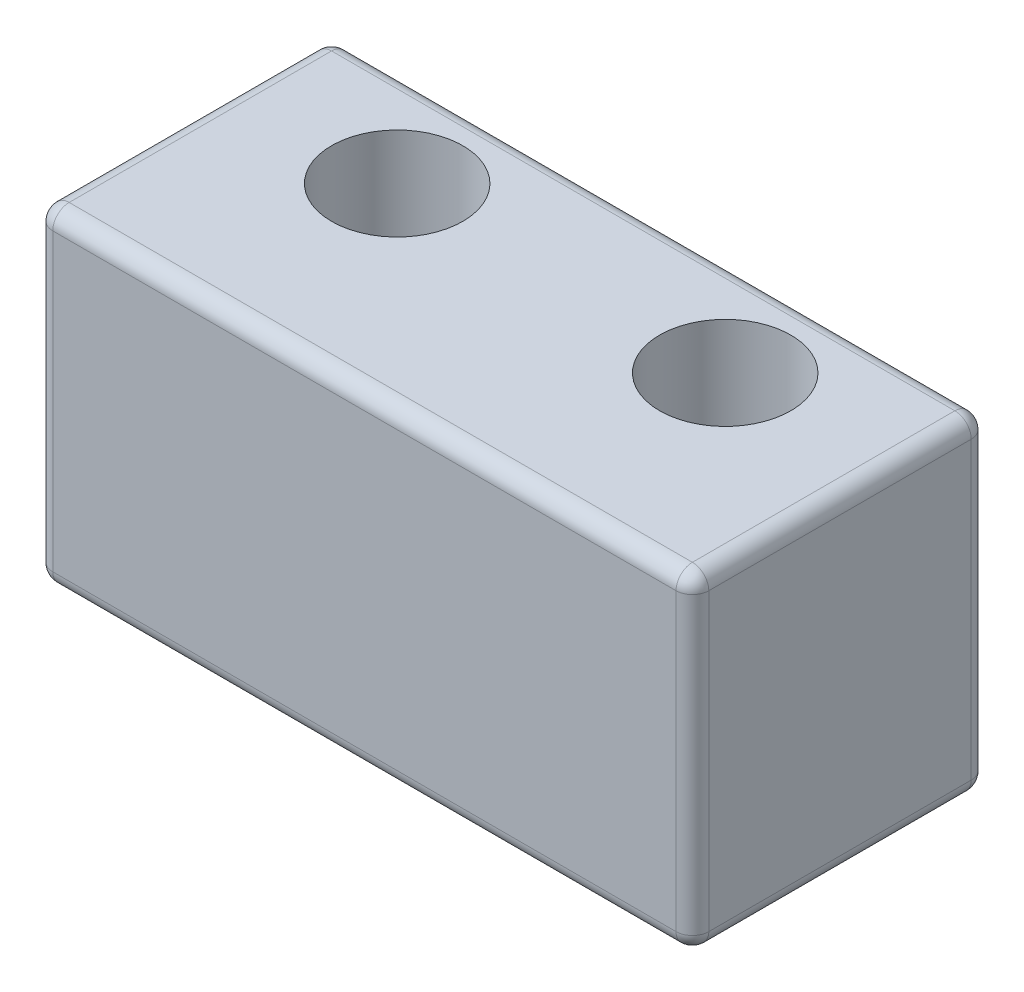
ISO-10303-21;
HEADER;
FILE_DESCRIPTION(('STEP AP214'),'2;1');
FILE_NAME('part.step','',(''),(''),'','','');
FILE_SCHEMA(('AUTOMOTIVE_DESIGN { 1 0 10303 214 1 1 1 1 }'));
ENDSEC;
DATA;
#1=APPLICATION_CONTEXT('core data for automotive mechanical design processes');
#2=APPLICATION_PROTOCOL_DEFINITION('international standard','automotive_design',2000,#1);
#3=PRODUCT_CONTEXT('',#1,'mechanical');
#4=PRODUCT('Part','Part','',(#3));
#5=PRODUCT_RELATED_PRODUCT_CATEGORY('part','',(#4));
#6=PRODUCT_DEFINITION_FORMATION('','',#4);
#7=PRODUCT_DEFINITION_CONTEXT('part definition',#1,'design');
#8=PRODUCT_DEFINITION('design','',#6,#7);
#9=PRODUCT_DEFINITION_SHAPE('','',#8);
#10=(LENGTH_UNIT() NAMED_UNIT(*) SI_UNIT(.MILLI.,.METRE.));
#11=(NAMED_UNIT(*) PLANE_ANGLE_UNIT() SI_UNIT($,.RADIAN.));
#12=(NAMED_UNIT(*) SI_UNIT($,.STERADIAN.) SOLID_ANGLE_UNIT());
#13=UNCERTAINTY_MEASURE_WITH_UNIT(LENGTH_MEASURE(1.E-05),#10,'distance_accuracy_value','');
#14=(GEOMETRIC_REPRESENTATION_CONTEXT(3) GLOBAL_UNCERTAINTY_ASSIGNED_CONTEXT((#13)) GLOBAL_UNIT_ASSIGNED_CONTEXT((#10,
#11,#12)) REPRESENTATION_CONTEXT('',''));
#15=CARTESIAN_POINT('',(0.,0.,0.));
#16=DIRECTION('',(0.,0.,1.));
#17=DIRECTION('',(1.,0.,0.));
#18=AXIS2_PLACEMENT_3D('',#15,#16,#17);
#19=CARTESIAN_POINT('',(-9.13793103448277,10.,1.85344827586207));
#20=DIRECTION('',(1.,0.,0.));
#21=DIRECTION('',(0.,0.,-1.));
#22=AXIS2_PLACEMENT_3D('',#19,#20,#21);
#23=PLANE('',#22);
#24=DIRECTION('',(0.,-1.,0.));
#25=VECTOR('',#24,1.);
#26=CARTESIAN_POINT('',(-9.13793103448277,10.,-2.64655172413793));
#27=LINE('',#26,#25);
#28=CARTESIAN_POINT('',(-9.13793103448277,9.5,-2.64655172413793));
#29=VERTEX_POINT('',#28);
#30=CARTESIAN_POINT('',(-9.13793103448277,0.5,-2.64655172413793));
#31=VERTEX_POINT('',#30);
#32=EDGE_CURVE('E198',#29,#31,#27,.T.);
#33=ORIENTED_EDGE('',*,*,#32,.T.);
#34=DIRECTION('',(0.,0.,1.));
#35=VECTOR('',#34,1.);
#36=CARTESIAN_POINT('',(-9.13793103448277,0.5,1.85344827586207));
#37=LINE('',#36,#35);
#38=CARTESIAN_POINT('',(-9.13793103448277,0.5,5.35344827586207));
#39=VERTEX_POINT('',#38);
#40=EDGE_CURVE('E200',#31,#39,#37,.T.);
#41=ORIENTED_EDGE('',*,*,#40,.T.);
#42=DIRECTION('',(0.,-1.,0.));
#43=VECTOR('',#42,1.);
#44=CARTESIAN_POINT('',(-9.13793103448277,10.,5.35344827586207));
#45=LINE('',#44,#43);
#46=CARTESIAN_POINT('',(-9.13793103448277,9.5,5.35344827586207));
#47=VERTEX_POINT('',#46);
#48=EDGE_CURVE('E196',#39,#47,#45,.F.);
#49=ORIENTED_EDGE('',*,*,#48,.T.);
#50=DIRECTION('',(0.,0.,1.));
#51=VECTOR('',#50,1.);
#52=CARTESIAN_POINT('',(-9.13793103448277,9.5,-3.14655172413793));
#53=LINE('',#52,#51);
#54=EDGE_CURVE('E194',#47,#29,#53,.F.);
#55=ORIENTED_EDGE('',*,*,#54,.T.);
#56=EDGE_LOOP('',(#33,#41,#49,#55));
#57=FACE_BOUND('',#56,.T.);
#58=ADVANCED_FACE('F33',(#57),#23,.F.);
#59=CARTESIAN_POINT('',(-9.13793103448277,10.,5.85344827586207));
#60=DIRECTION('',(0.,0.,-1.));
#61=DIRECTION('',(-1.,0.,0.));
#62=AXIS2_PLACEMENT_3D('',#59,#60,#61);
#63=PLANE('',#62);
#64=DIRECTION('',(0.,-1.,0.));
#65=VECTOR('',#64,1.);
#66=CARTESIAN_POINT('',(-8.63793103448277,10.,5.85344827586207));
#67=LINE('',#66,#65);
#68=CARTESIAN_POINT('',(-8.63793103448277,9.5,5.85344827586207));
#69=VERTEX_POINT('',#68);
#70=CARTESIAN_POINT('',(-8.63793103448277,0.5,5.85344827586207));
#71=VERTEX_POINT('',#70);
#72=EDGE_CURVE('E178',#69,#71,#67,.T.);
#73=ORIENTED_EDGE('',*,*,#72,.T.);
#74=DIRECTION('',(1.,0.,0.));
#75=VECTOR('',#74,1.);
#76=CARTESIAN_POINT('',(-9.13793103448277,0.5,5.85344827586207));
#77=LINE('',#76,#75);
#78=CARTESIAN_POINT('',(10.3620689655172,0.5,5.85344827586207));
#79=VERTEX_POINT('',#78);
#80=EDGE_CURVE('E182',#71,#79,#77,.T.);
#81=ORIENTED_EDGE('',*,*,#80,.T.);
#82=DIRECTION('',(0.,-1.,0.));
#83=VECTOR('',#82,1.);
#84=CARTESIAN_POINT('',(10.3620689655172,10.,5.85344827586207));
#85=LINE('',#84,#83);
#86=CARTESIAN_POINT('',(10.3620689655172,9.5,5.85344827586207));
#87=VERTEX_POINT('',#86);
#88=EDGE_CURVE('E180',#79,#87,#85,.F.);
#89=ORIENTED_EDGE('',*,*,#88,.T.);
#90=DIRECTION('',(1.,0.,0.));
#91=VECTOR('',#90,1.);
#92=CARTESIAN_POINT('',(-9.13793103448277,9.5,5.85344827586207));
#93=LINE('',#92,#91);
#94=EDGE_CURVE('E176',#87,#69,#93,.F.);
#95=ORIENTED_EDGE('',*,*,#94,.T.);
#96=EDGE_LOOP('',(#73,#81,#89,#95));
#97=FACE_BOUND('',#96,.T.);
#98=ADVANCED_FACE('F293',(#97),#63,.F.);
#99=CARTESIAN_POINT('',(10.8620689655172,10.,-3.14655172413793));
#100=DIRECTION('',(-1.,0.,0.));
#101=DIRECTION('',(0.,0.,1.));
#102=AXIS2_PLACEMENT_3D('',#99,#100,#101);
#103=PLANE('',#102);
#104=DIRECTION('',(0.,0.,-1.));
#105=VECTOR('',#104,1.);
#106=CARTESIAN_POINT('',(10.8620689655172,0.5,-3.14655172413793));
#107=LINE('',#106,#105);
#108=CARTESIAN_POINT('',(10.8620689655172,0.5,5.35344827586207));
#109=VERTEX_POINT('',#108);
#110=CARTESIAN_POINT('',(10.8620689655172,0.5,-2.64655172413793));
#111=VERTEX_POINT('',#110);
#112=EDGE_CURVE('E133',#109,#111,#107,.T.);
#113=ORIENTED_EDGE('',*,*,#112,.T.);
#114=DIRECTION('',(0.,-1.,0.));
#115=VECTOR('',#114,1.);
#116=CARTESIAN_POINT('',(10.8620689655172,10.,-2.64655172413793));
#117=LINE('',#116,#115);
#118=CARTESIAN_POINT('',(10.8620689655172,9.5,-2.64655172413793));
#119=VERTEX_POINT('',#118);
#120=EDGE_CURVE('E129',#111,#119,#117,.F.);
#121=ORIENTED_EDGE('',*,*,#120,.T.);
#122=DIRECTION('',(0.,0.,-1.));
#123=VECTOR('',#122,1.);
#124=CARTESIAN_POINT('',(10.8620689655172,9.5,5.85344827586207));
#125=LINE('',#124,#123);
#126=CARTESIAN_POINT('',(10.8620689655172,9.5,5.35344827586207));
#127=VERTEX_POINT('',#126);
#128=EDGE_CURVE('E121',#119,#127,#125,.F.);
#129=ORIENTED_EDGE('',*,*,#128,.T.);
#130=DIRECTION('',(0.,-1.,0.));
#131=VECTOR('',#130,1.);
#132=CARTESIAN_POINT('',(10.8620689655172,10.,5.35344827586207));
#133=LINE('',#132,#131);
#134=EDGE_CURVE('E126',#127,#109,#133,.T.);
#135=ORIENTED_EDGE('',*,*,#134,.T.);
#136=EDGE_LOOP('',(#113,#121,#129,#135));
#137=FACE_BOUND('',#136,.T.);
#138=ADVANCED_FACE('F124',(#137),#103,.F.);
#139=CARTESIAN_POINT('',(-9.13793103448277,10.,-3.14655172413793));
#140=DIRECTION('',(0.,0.,1.));
#141=DIRECTION('',(1.,0.,0.));
#142=AXIS2_PLACEMENT_3D('',#139,#140,#141);
#143=PLANE('',#142);
#144=DIRECTION('',(0.,-1.,0.));
#145=VECTOR('',#144,1.);
#146=CARTESIAN_POINT('',(10.3620689655172,10.,-3.14655172413793));
#147=LINE('',#146,#145);
#148=CARTESIAN_POINT('',(10.3620689655172,9.5,-3.14655172413793));
#149=VERTEX_POINT('',#148);
#150=CARTESIAN_POINT('',(10.3620689655172,0.5,-3.14655172413793));
#151=VERTEX_POINT('',#150);
#152=EDGE_CURVE('E187',#149,#151,#147,.T.);
#153=ORIENTED_EDGE('',*,*,#152,.T.);
#154=DIRECTION('',(-1.,0.,0.));
#155=VECTOR('',#154,1.);
#156=CARTESIAN_POINT('',(-9.13793103448277,0.5,-3.14655172413793));
#157=LINE('',#156,#155);
#158=CARTESIAN_POINT('',(-8.63793103448277,0.5,-3.14655172413793));
#159=VERTEX_POINT('',#158);
#160=EDGE_CURVE('E191',#151,#159,#157,.T.);
#161=ORIENTED_EDGE('',*,*,#160,.T.);
#162=DIRECTION('',(0.,-1.,0.));
#163=VECTOR('',#162,1.);
#164=CARTESIAN_POINT('',(-8.63793103448277,10.,-3.14655172413793));
#165=LINE('',#164,#163);
#166=CARTESIAN_POINT('',(-8.63793103448277,9.5,-3.14655172413793));
#167=VERTEX_POINT('',#166);
#168=EDGE_CURVE('E189',#159,#167,#165,.F.);
#169=ORIENTED_EDGE('',*,*,#168,.T.);
#170=DIRECTION('',(-1.,0.,0.));
#171=VECTOR('',#170,1.);
#172=CARTESIAN_POINT('',(10.8620689655172,9.5,-3.14655172413793));
#173=LINE('',#172,#171);
#174=EDGE_CURVE('E185',#167,#149,#173,.F.);
#175=ORIENTED_EDGE('',*,*,#174,.T.);
#176=EDGE_LOOP('',(#153,#161,#169,#175));
#177=FACE_BOUND('',#176,.T.);
#178=ADVANCED_FACE('F280',(#177),#143,.F.);
#179=CARTESIAN_POINT('',(0.,10.,0.));
#180=DIRECTION('',(0.,1.,0.));
#181=DIRECTION('',(0.,0.,1.));
#182=AXIS2_PLACEMENT_3D('',#179,#180,#181);
#183=PLANE('',#182);
#184=DIRECTION('',(0.,0.,1.));
#185=VECTOR('',#184,1.);
#186=CARTESIAN_POINT('',(-8.63793103448277,10.,5.85344827586207));
#187=LINE('',#186,#185);
#188=CARTESIAN_POINT('',(-8.63793103448277,10.,-2.64655172413793));
#189=VERTEX_POINT('',#188);
#190=CARTESIAN_POINT('',(-8.63793103448277,10.,5.35344827586207));
#191=VERTEX_POINT('',#190);
#192=EDGE_CURVE('E53',#189,#191,#187,.T.);
#193=ORIENTED_EDGE('',*,*,#192,.T.);
#194=DIRECTION('',(1.,0.,0.));
#195=VECTOR('',#194,1.);
#196=CARTESIAN_POINT('',(10.8620689655172,10.,5.35344827586207));
#197=LINE('',#196,#195);
#198=CARTESIAN_POINT('',(10.3620689655172,10.,5.35344827586207));
#199=VERTEX_POINT('',#198);
#200=EDGE_CURVE('E11',#191,#199,#197,.T.);
#201=ORIENTED_EDGE('',*,*,#200,.T.);
#202=DIRECTION('',(0.,0.,-1.));
#203=VECTOR('',#202,1.);
#204=CARTESIAN_POINT('',(10.3620689655172,10.,-3.14655172413793));
#205=LINE('',#204,#203);
#206=CARTESIAN_POINT('',(10.3620689655172,10.,-2.64655172413793));
#207=VERTEX_POINT('',#206);
#208=EDGE_CURVE('E42',#199,#207,#205,.T.);
#209=ORIENTED_EDGE('',*,*,#208,.T.);
#210=DIRECTION('',(-1.,0.,0.));
#211=VECTOR('',#210,1.);
#212=CARTESIAN_POINT('',(-9.13793103448277,10.,-2.64655172413793));
#213=LINE('',#212,#211);
#214=EDGE_CURVE('E203',#207,#189,#213,.T.);
#215=ORIENTED_EDGE('',*,*,#214,.T.);
#216=EDGE_LOOP('',(#193,#201,#209,#215));
#217=FACE_BOUND('',#216,.T.);
#218=CARTESIAN_POINT('',(-4.13793103448277,10.,-0.14655172413793));
#219=DIRECTION('',(0.,1.,0.));
#220=DIRECTION('',(0.,0.,1.));
#221=AXIS2_PLACEMENT_3D('',#218,#219,#220);
#222=CIRCLE('',#221,2.);
#223=CARTESIAN_POINT('',(-4.13793103448277,10.,1.85344827586207));
#224=VERTEX_POINT('',#223);
#225=EDGE_CURVE('E159',#224,#224,#222,.T.);
#226=ORIENTED_EDGE('',*,*,#225,.F.);
#227=EDGE_LOOP('',(#226));
#228=FACE_BOUND('',#227,.T.);
#229=CARTESIAN_POINT('',(5.86206896551723,10.,-0.146551724137932));
#230=DIRECTION('',(0.,1.,0.));
#231=DIRECTION('',(0.,0.,1.));
#232=AXIS2_PLACEMENT_3D('',#229,#230,#231);
#233=CIRCLE('',#232,2.);
#234=CARTESIAN_POINT('',(5.86206896551723,10.,1.85344827586207));
#235=VERTEX_POINT('',#234);
#236=EDGE_CURVE('E264',#235,#235,#233,.T.);
#237=ORIENTED_EDGE('',*,*,#236,.F.);
#238=EDGE_LOOP('',(#237));
#239=FACE_BOUND('',#238,.T.);
#240=ADVANCED_FACE('F276',(#217,#228,#239),#183,.T.);
#241=CARTESIAN_POINT('',(0.,0.,0.));
#242=DIRECTION('',(0.,1.,0.));
#243=DIRECTION('',(0.,0.,1.));
#244=AXIS2_PLACEMENT_3D('',#241,#242,#243);
#245=PLANE('',#244);
#246=DIRECTION('',(-1.,0.,0.));
#247=VECTOR('',#246,1.);
#248=CARTESIAN_POINT('',(0.,0.,-2.64655172413793));
#249=LINE('',#248,#247);
#250=CARTESIAN_POINT('',(-8.63793103448277,0.,-2.64655172413793));
#251=VERTEX_POINT('',#250);
#252=CARTESIAN_POINT('',(10.3620689655172,0.,-2.64655172413793));
#253=VERTEX_POINT('',#252);
#254=EDGE_CURVE('E169',#251,#253,#249,.F.);
#255=ORIENTED_EDGE('',*,*,#254,.T.);
#256=DIRECTION('',(0.,0.,-1.));
#257=VECTOR('',#256,1.);
#258=CARTESIAN_POINT('',(10.3620689655172,0.,0.));
#259=LINE('',#258,#257);
#260=CARTESIAN_POINT('',(10.3620689655172,0.,5.35344827586207));
#261=VERTEX_POINT('',#260);
#262=EDGE_CURVE('E173',#253,#261,#259,.F.);
#263=ORIENTED_EDGE('',*,*,#262,.T.);
#264=DIRECTION('',(1.,0.,0.));
#265=VECTOR('',#264,1.);
#266=CARTESIAN_POINT('',(0.,0.,5.35344827586207));
#267=LINE('',#266,#265);
#268=CARTESIAN_POINT('',(-8.63793103448277,0.,5.35344827586207));
#269=VERTEX_POINT('',#268);
#270=EDGE_CURVE('E171',#261,#269,#267,.F.);
#271=ORIENTED_EDGE('',*,*,#270,.T.);
#272=DIRECTION('',(0.,0.,1.));
#273=VECTOR('',#272,1.);
#274=CARTESIAN_POINT('',(-8.63793103448277,0.,0.));
#275=LINE('',#274,#273);
#276=EDGE_CURVE('E167',#269,#251,#275,.F.);
#277=ORIENTED_EDGE('',*,*,#276,.T.);
#278=EDGE_LOOP('',(#255,#263,#271,#277));
#279=FACE_BOUND('',#278,.T.);
#280=ADVANCED_FACE('F279',(#279),#245,.F.);
#281=CARTESIAN_POINT('',(5.86206896551723,5.,-0.146551724137932));
#282=DIRECTION('',(0.,1.,0.));
#283=DIRECTION('',(0.,0.,1.));
#284=AXIS2_PLACEMENT_3D('',#281,#282,#283);
#285=CYLINDRICAL_SURFACE('',#284,2.);
#286=CARTESIAN_POINT('',(5.86206896551723,5.,-0.146551724137932));
#287=DIRECTION('',(0.,1.,0.));
#288=DIRECTION('',(0.,0.,1.));
#289=AXIS2_PLACEMENT_3D('',#286,#287,#288);
#290=CIRCLE('',#289,2.);
#291=CARTESIAN_POINT('',(5.86206896551723,5.,1.85344827586207));
#292=VERTEX_POINT('',#291);
#293=EDGE_CURVE('E162',#292,#292,#290,.T.);
#294=ORIENTED_EDGE('',*,*,#293,.F.);
#295=EDGE_LOOP('',(#294));
#296=FACE_BOUND('',#295,.T.);
#297=ORIENTED_EDGE('',*,*,#236,.T.);
#298=EDGE_LOOP('',(#297));
#299=FACE_BOUND('',#298,.T.);
#300=ADVANCED_FACE('F286',(#296,#299),#285,.F.);
#301=CARTESIAN_POINT('',(5.86206896551723,5.,-0.146551724137932));
#302=DIRECTION('',(0.,1.,0.));
#303=DIRECTION('',(0.,0.,1.));
#304=AXIS2_PLACEMENT_3D('',#301,#302,#303);
#305=PLANE('',#304);
#306=ORIENTED_EDGE('',*,*,#293,.T.);
#307=EDGE_LOOP('',(#306));
#308=FACE_BOUND('',#307,.T.);
#309=ADVANCED_FACE('F411',(#308),#305,.T.);
#310=CARTESIAN_POINT('',(-4.13793103448277,5.,-0.14655172413793));
#311=DIRECTION('',(0.,1.,0.));
#312=DIRECTION('',(0.,0.,1.));
#313=AXIS2_PLACEMENT_3D('',#310,#311,#312);
#314=CYLINDRICAL_SURFACE('',#313,2.);
#315=CARTESIAN_POINT('',(-4.13793103448277,5.,-0.14655172413793));
#316=DIRECTION('',(0.,1.,0.));
#317=DIRECTION('',(0.,0.,1.));
#318=AXIS2_PLACEMENT_3D('',#315,#316,#317);
#319=CIRCLE('',#318,2.);
#320=CARTESIAN_POINT('',(-4.13793103448277,5.,1.85344827586207));
#321=VERTEX_POINT('',#320);
#322=EDGE_CURVE('E156',#321,#321,#319,.T.);
#323=ORIENTED_EDGE('',*,*,#322,.F.);
#324=EDGE_LOOP('',(#323));
#325=FACE_BOUND('',#324,.T.);
#326=ORIENTED_EDGE('',*,*,#225,.T.);
#327=EDGE_LOOP('',(#326));
#328=FACE_BOUND('',#327,.T.);
#329=ADVANCED_FACE('F274',(#325,#328),#314,.F.);
#330=CARTESIAN_POINT('',(-4.13793103448277,5.,-0.14655172413793));
#331=DIRECTION('',(0.,1.,0.));
#332=DIRECTION('',(0.,0.,1.));
#333=AXIS2_PLACEMENT_3D('',#330,#331,#332);
#334=PLANE('',#333);
#335=ORIENTED_EDGE('',*,*,#322,.T.);
#336=EDGE_LOOP('',(#335));
#337=FACE_BOUND('',#336,.T.);
#338=ADVANCED_FACE('F372',(#337),#334,.T.);
#339=CARTESIAN_POINT('',(-8.63793103448277,9.5,0.));
#340=DIRECTION('',(0.,0.,-1.));
#341=DIRECTION('',(-1.,0.,0.));
#342=AXIS2_PLACEMENT_3D('',#339,#340,#341);
#343=CYLINDRICAL_SURFACE('',#342,0.5);
#344=CARTESIAN_POINT('',(-8.63793103448277,9.5,5.35344827586207));
#345=DIRECTION('',(0.,0.,1.));
#346=DIRECTION('',(1.,0.,0.));
#347=AXIS2_PLACEMENT_3D('',#344,#345,#346);
#348=CIRCLE('',#347,0.5);
#349=EDGE_CURVE('E37',#191,#47,#348,.T.);
#350=ORIENTED_EDGE('',*,*,#349,.F.);
#351=ORIENTED_EDGE('',*,*,#192,.F.);
#352=CARTESIAN_POINT('',(-8.63793103448277,9.5,-2.64655172413793));
#353=DIRECTION('',(0.,0.,-1.));
#354=DIRECTION('',(0.,1.,0.));
#355=AXIS2_PLACEMENT_3D('',#352,#353,#354);
#356=CIRCLE('',#355,0.5);
#357=EDGE_CURVE('E253',#29,#189,#356,.T.);
#358=ORIENTED_EDGE('',*,*,#357,.F.);
#359=ORIENTED_EDGE('',*,*,#54,.F.);
#360=EDGE_LOOP('',(#350,#351,#358,#359));
#361=FACE_BOUND('',#360,.T.);
#362=ADVANCED_FACE('F35',(#361),#343,.T.);
#363=CARTESIAN_POINT('',(-8.63793103448277,9.5,5.35344827586207));
#364=DIRECTION('',(-1.,0.,0.));
#365=DIRECTION('',(0.,0.,1.));
#366=AXIS2_PLACEMENT_3D('',#363,#364,#365);
#367=SPHERICAL_SURFACE('',#366,0.5);
#368=CARTESIAN_POINT('',(-8.63793103448277,9.5,5.35344827586207));
#369=DIRECTION('',(-1.,0.,0.));
#370=DIRECTION('',(0.,0.,1.));
#371=AXIS2_PLACEMENT_3D('',#368,#369,#370);
#372=CIRCLE('',#371,0.5);
#373=EDGE_CURVE('E248',#191,#69,#372,.F.);
#374=ORIENTED_EDGE('',*,*,#373,.F.);
#375=ORIENTED_EDGE('',*,*,#349,.T.);
#376=CARTESIAN_POINT('',(-8.63793103448277,9.5,5.35344827586207));
#377=DIRECTION('',(0.,1.,0.));
#378=DIRECTION('',(0.,0.,1.));
#379=AXIS2_PLACEMENT_3D('',#376,#377,#378);
#380=CIRCLE('',#379,0.5);
#381=EDGE_CURVE('E251',#69,#47,#380,.F.);
#382=ORIENTED_EDGE('',*,*,#381,.F.);
#383=EDGE_LOOP('',(#374,#375,#382));
#384=FACE_BOUND('',#383,.T.);
#385=ADVANCED_FACE('F367',(#384),#367,.T.);
#386=CARTESIAN_POINT('',(-8.63793103448277,9.5,-2.64655172413793));
#387=DIRECTION('',(0.,1.,0.));
#388=DIRECTION('',(0.,0.,1.));
#389=AXIS2_PLACEMENT_3D('',#386,#387,#388);
#390=SPHERICAL_SURFACE('',#389,0.5);
#391=CARTESIAN_POINT('',(-8.63793103448277,9.5,-2.64655172413793));
#392=DIRECTION('',(0.,1.,0.));
#393=DIRECTION('',(0.,0.,1.));
#394=AXIS2_PLACEMENT_3D('',#391,#392,#393);
#395=CIRCLE('',#394,0.5);
#396=EDGE_CURVE('E242',#29,#167,#395,.F.);
#397=ORIENTED_EDGE('',*,*,#396,.F.);
#398=ORIENTED_EDGE('',*,*,#357,.T.);
#399=CARTESIAN_POINT('',(-8.63793103448277,9.5,-2.64655172413793));
#400=DIRECTION('',(-1.,0.,0.));
#401=DIRECTION('',(0.,0.,1.));
#402=AXIS2_PLACEMENT_3D('',#399,#400,#401);
#403=CIRCLE('',#402,0.5);
#404=EDGE_CURVE('E245',#167,#189,#403,.F.);
#405=ORIENTED_EDGE('',*,*,#404,.F.);
#406=EDGE_LOOP('',(#397,#398,#405));
#407=FACE_BOUND('',#406,.T.);
#408=ADVANCED_FACE('F364',(#407),#390,.T.);
#409=CARTESIAN_POINT('',(-8.63793103448277,10.,5.35344827586207));
#410=DIRECTION('',(0.,-1.,0.));
#411=DIRECTION('',(0.,0.,-1.));
#412=AXIS2_PLACEMENT_3D('',#409,#410,#411);
#413=CYLINDRICAL_SURFACE('',#412,0.5);
#414=ORIENTED_EDGE('',*,*,#381,.T.);
#415=ORIENTED_EDGE('',*,*,#48,.F.);
#416=CARTESIAN_POINT('',(-8.63793103448277,0.5,5.35344827586207));
#417=DIRECTION('',(0.,-1.,0.));
#418=DIRECTION('',(0.,0.,-1.));
#419=AXIS2_PLACEMENT_3D('',#416,#417,#418);
#420=CIRCLE('',#419,0.5);
#421=EDGE_CURVE('E237',#71,#39,#420,.T.);
#422=ORIENTED_EDGE('',*,*,#421,.F.);
#423=ORIENTED_EDGE('',*,*,#72,.F.);
#424=EDGE_LOOP('',(#414,#415,#422,#423));
#425=FACE_BOUND('',#424,.T.);
#426=ADVANCED_FACE('F360',(#425),#413,.T.);
#427=CARTESIAN_POINT('',(0.,9.5,5.35344827586207));
#428=DIRECTION('',(-1.,0.,0.));
#429=DIRECTION('',(0.,0.,1.));
#430=AXIS2_PLACEMENT_3D('',#427,#428,#429);
#431=CYLINDRICAL_SURFACE('',#430,0.5);
#432=ORIENTED_EDGE('',*,*,#373,.T.);
#433=ORIENTED_EDGE('',*,*,#94,.F.);
#434=CARTESIAN_POINT('',(10.3620689655172,9.5,5.35344827586207));
#435=DIRECTION('',(1.,0.,0.));
#436=DIRECTION('',(0.,0.,-1.));
#437=AXIS2_PLACEMENT_3D('',#434,#435,#436);
#438=CIRCLE('',#437,0.5);
#439=EDGE_CURVE('E142',#199,#87,#438,.T.);
#440=ORIENTED_EDGE('',*,*,#439,.F.);
#441=ORIENTED_EDGE('',*,*,#200,.F.);
#442=EDGE_LOOP('',(#432,#433,#440,#441));
#443=FACE_BOUND('',#442,.T.);
#444=ADVANCED_FACE('F357',(#443),#431,.T.);
#445=CARTESIAN_POINT('',(10.3620689655172,9.5,0.));
#446=DIRECTION('',(0.,0.,1.));
#447=DIRECTION('',(1.,0.,0.));
#448=AXIS2_PLACEMENT_3D('',#445,#446,#447);
#449=CYLINDRICAL_SURFACE('',#448,0.5);
#450=CARTESIAN_POINT('',(10.3620689655172,9.5,-2.64655172413793));
#451=DIRECTION('',(0.,0.,-1.));
#452=DIRECTION('',(-1.,0.,0.));
#453=AXIS2_PLACEMENT_3D('',#450,#451,#452);
#454=CIRCLE('',#453,0.5);
#455=EDGE_CURVE('E143',#207,#119,#454,.T.);
#456=ORIENTED_EDGE('',*,*,#455,.F.);
#457=ORIENTED_EDGE('',*,*,#208,.F.);
#458=CARTESIAN_POINT('',(10.3620689655172,9.5,5.35344827586207));
#459=DIRECTION('',(0.,0.,1.));
#460=DIRECTION('',(0.,-1.,0.));
#461=AXIS2_PLACEMENT_3D('',#458,#459,#460);
#462=CIRCLE('',#461,0.5);
#463=EDGE_CURVE('E136',#127,#199,#462,.T.);
#464=ORIENTED_EDGE('',*,*,#463,.F.);
#465=ORIENTED_EDGE('',*,*,#128,.F.);
#466=EDGE_LOOP('',(#456,#457,#464,#465));
#467=FACE_BOUND('',#466,.T.);
#468=ADVANCED_FACE('F138',(#467),#449,.T.);
#469=CARTESIAN_POINT('',(0.,9.5,-2.64655172413793));
#470=DIRECTION('',(1.,0.,0.));
#471=DIRECTION('',(0.,0.,-1.));
#472=AXIS2_PLACEMENT_3D('',#469,#470,#471);
#473=CYLINDRICAL_SURFACE('',#472,0.5);
#474=ORIENTED_EDGE('',*,*,#404,.T.);
#475=ORIENTED_EDGE('',*,*,#214,.F.);
#476=CARTESIAN_POINT('',(10.3620689655172,9.5,-2.64655172413793));
#477=DIRECTION('',(1.,0.,0.));
#478=DIRECTION('',(0.,0.,-1.));
#479=AXIS2_PLACEMENT_3D('',#476,#477,#478);
#480=CIRCLE('',#479,0.5);
#481=EDGE_CURVE('E233',#149,#207,#480,.T.);
#482=ORIENTED_EDGE('',*,*,#481,.F.);
#483=ORIENTED_EDGE('',*,*,#174,.F.);
#484=EDGE_LOOP('',(#474,#475,#482,#483));
#485=FACE_BOUND('',#484,.T.);
#486=ADVANCED_FACE('F350',(#485),#473,.T.);
#487=CARTESIAN_POINT('',(-8.63793103448277,10.,-2.64655172413793));
#488=DIRECTION('',(0.,-1.,0.));
#489=DIRECTION('',(0.,0.,-1.));
#490=AXIS2_PLACEMENT_3D('',#487,#488,#489);
#491=CYLINDRICAL_SURFACE('',#490,0.5);
#492=ORIENTED_EDGE('',*,*,#396,.T.);
#493=ORIENTED_EDGE('',*,*,#168,.F.);
#494=CARTESIAN_POINT('',(-8.63793103448277,0.5,-2.64655172413793));
#495=DIRECTION('',(0.,-1.,0.));
#496=DIRECTION('',(0.,0.,-1.));
#497=AXIS2_PLACEMENT_3D('',#494,#495,#496);
#498=CIRCLE('',#497,0.5);
#499=EDGE_CURVE('E230',#31,#159,#498,.T.);
#500=ORIENTED_EDGE('',*,*,#499,.F.);
#501=ORIENTED_EDGE('',*,*,#32,.F.);
#502=EDGE_LOOP('',(#492,#493,#500,#501));
#503=FACE_BOUND('',#502,.T.);
#504=ADVANCED_FACE('F346',(#503),#491,.T.);
#505=CARTESIAN_POINT('',(-8.63793103448277,0.5,1.85344827586207));
#506=DIRECTION('',(0.,0.,1.));
#507=DIRECTION('',(1.,0.,0.));
#508=AXIS2_PLACEMENT_3D('',#505,#506,#507);
#509=CYLINDRICAL_SURFACE('',#508,0.5);
#510=CARTESIAN_POINT('',(-8.63793103448277,0.5,5.35344827586207));
#511=DIRECTION('',(0.,0.,1.));
#512=DIRECTION('',(1.,0.,0.));
#513=AXIS2_PLACEMENT_3D('',#510,#511,#512);
#514=CIRCLE('',#513,0.5);
#515=EDGE_CURVE('E239',#39,#269,#514,.T.);
#516=ORIENTED_EDGE('',*,*,#515,.F.);
#517=ORIENTED_EDGE('',*,*,#40,.F.);
#518=CARTESIAN_POINT('',(-8.63793103448277,0.5,-2.64655172413793));
#519=DIRECTION('',(0.,0.,-1.));
#520=DIRECTION('',(-1.,0.,0.));
#521=AXIS2_PLACEMENT_3D('',#518,#519,#520);
#522=CIRCLE('',#521,0.5);
#523=EDGE_CURVE('E227',#251,#31,#522,.T.);
#524=ORIENTED_EDGE('',*,*,#523,.F.);
#525=ORIENTED_EDGE('',*,*,#276,.F.);
#526=EDGE_LOOP('',(#516,#517,#524,#525));
#527=FACE_BOUND('',#526,.T.);
#528=ADVANCED_FACE('F342',(#527),#509,.T.);
#529=CARTESIAN_POINT('',(-8.63793103448277,0.5,5.35344827586207));
#530=DIRECTION('',(-1.,0.,0.));
#531=DIRECTION('',(0.,-1.,0.));
#532=AXIS2_PLACEMENT_3D('',#529,#530,#531);
#533=SPHERICAL_SURFACE('',#532,0.5);
#534=ORIENTED_EDGE('',*,*,#421,.T.);
#535=ORIENTED_EDGE('',*,*,#515,.T.);
#536=CARTESIAN_POINT('',(-8.63793103448277,0.5,5.35344827586207));
#537=DIRECTION('',(-1.,0.,0.));
#538=DIRECTION('',(0.,0.,1.));
#539=AXIS2_PLACEMENT_3D('',#536,#537,#538);
#540=CIRCLE('',#539,0.5);
#541=EDGE_CURVE('E150',#71,#269,#540,.F.);
#542=ORIENTED_EDGE('',*,*,#541,.F.);
#543=EDGE_LOOP('',(#534,#535,#542));
#544=FACE_BOUND('',#543,.T.);
#545=ADVANCED_FACE('F339',(#544),#533,.T.);
#546=CARTESIAN_POINT('',(10.3620689655172,9.5,5.35344827586207));
#547=DIRECTION('',(0.,1.,0.));
#548=DIRECTION('',(0.,0.,1.));
#549=AXIS2_PLACEMENT_3D('',#546,#547,#548);
#550=SPHERICAL_SURFACE('',#549,0.5);
#551=ORIENTED_EDGE('',*,*,#463,.T.);
#552=ORIENTED_EDGE('',*,*,#439,.T.);
#553=CARTESIAN_POINT('',(10.3620689655172,9.5,5.35344827586207));
#554=DIRECTION('',(0.,1.,0.));
#555=DIRECTION('',(0.,0.,1.));
#556=AXIS2_PLACEMENT_3D('',#553,#554,#555);
#557=CIRCLE('',#556,0.5);
#558=EDGE_CURVE('E146',#127,#87,#557,.F.);
#559=ORIENTED_EDGE('',*,*,#558,.F.);
#560=EDGE_LOOP('',(#551,#552,#559));
#561=FACE_BOUND('',#560,.T.);
#562=ADVANCED_FACE('F147',(#561),#550,.T.);
#563=CARTESIAN_POINT('',(10.3620689655172,9.5,-2.64655172413793));
#564=DIRECTION('',(0.,1.,0.));
#565=DIRECTION('',(0.,0.,1.));
#566=AXIS2_PLACEMENT_3D('',#563,#564,#565);
#567=SPHERICAL_SURFACE('',#566,0.5);
#568=ORIENTED_EDGE('',*,*,#481,.T.);
#569=ORIENTED_EDGE('',*,*,#455,.T.);
#570=CARTESIAN_POINT('',(10.3620689655172,9.5,-2.64655172413793));
#571=DIRECTION('',(0.,1.,0.));
#572=DIRECTION('',(0.,0.,1.));
#573=AXIS2_PLACEMENT_3D('',#570,#571,#572);
#574=CIRCLE('',#573,0.5);
#575=EDGE_CURVE('E151',#149,#119,#574,.F.);
#576=ORIENTED_EDGE('',*,*,#575,.F.);
#577=EDGE_LOOP('',(#568,#569,#576));
#578=FACE_BOUND('',#577,.T.);
#579=ADVANCED_FACE('F332',(#578),#567,.T.);
#580=CARTESIAN_POINT('',(-8.63793103448277,0.5,-2.64655172413793));
#581=DIRECTION('',(-1.,0.,0.));
#582=DIRECTION('',(0.,0.,1.));
#583=AXIS2_PLACEMENT_3D('',#580,#581,#582);
#584=SPHERICAL_SURFACE('',#583,0.5);
#585=ORIENTED_EDGE('',*,*,#523,.T.);
#586=ORIENTED_EDGE('',*,*,#499,.T.);
#587=CARTESIAN_POINT('',(-8.63793103448277,0.5,-2.64655172413793));
#588=DIRECTION('',(-1.,0.,0.));
#589=DIRECTION('',(0.,0.,1.));
#590=AXIS2_PLACEMENT_3D('',#587,#588,#589);
#591=CIRCLE('',#590,0.5);
#592=EDGE_CURVE('E221',#251,#159,#591,.F.);
#593=ORIENTED_EDGE('',*,*,#592,.F.);
#594=EDGE_LOOP('',(#585,#586,#593));
#595=FACE_BOUND('',#594,.T.);
#596=ADVANCED_FACE('F328',(#595),#584,.T.);
#597=CARTESIAN_POINT('',(-9.13793103448277,0.5,5.35344827586207));
#598=DIRECTION('',(1.,0.,0.));
#599=DIRECTION('',(0.,0.,-1.));
#600=AXIS2_PLACEMENT_3D('',#597,#598,#599);
#601=CYLINDRICAL_SURFACE('',#600,0.5);
#602=ORIENTED_EDGE('',*,*,#541,.T.);
#603=ORIENTED_EDGE('',*,*,#270,.F.);
#604=CARTESIAN_POINT('',(10.3620689655172,0.5,5.35344827586207));
#605=DIRECTION('',(1.,0.,0.));
#606=DIRECTION('',(0.,0.,-1.));
#607=AXIS2_PLACEMENT_3D('',#604,#605,#606);
#608=CIRCLE('',#607,0.5);
#609=EDGE_CURVE('E218',#79,#261,#608,.T.);
#610=ORIENTED_EDGE('',*,*,#609,.F.);
#611=ORIENTED_EDGE('',*,*,#80,.F.);
#612=EDGE_LOOP('',(#602,#603,#610,#611));
#613=FACE_BOUND('',#612,.T.);
#614=ADVANCED_FACE('F325',(#613),#601,.T.);
#615=CARTESIAN_POINT('',(10.3620689655172,10.,5.35344827586207));
#616=DIRECTION('',(0.,-1.,0.));
#617=DIRECTION('',(0.,0.,-1.));
#618=AXIS2_PLACEMENT_3D('',#615,#616,#617);
#619=CYLINDRICAL_SURFACE('',#618,0.5);
#620=ORIENTED_EDGE('',*,*,#558,.T.);
#621=ORIENTED_EDGE('',*,*,#88,.F.);
#622=CARTESIAN_POINT('',(10.3620689655172,0.5,5.35344827586207));
#623=DIRECTION('',(0.,-1.,0.));
#624=DIRECTION('',(0.,0.,-1.));
#625=AXIS2_PLACEMENT_3D('',#622,#623,#624);
#626=CIRCLE('',#625,0.5);
#627=EDGE_CURVE('E154',#109,#79,#626,.T.);
#628=ORIENTED_EDGE('',*,*,#627,.F.);
#629=ORIENTED_EDGE('',*,*,#134,.F.);
#630=EDGE_LOOP('',(#620,#621,#628,#629));
#631=FACE_BOUND('',#630,.T.);
#632=ADVANCED_FACE('F153',(#631),#619,.T.);
#633=CARTESIAN_POINT('',(10.3620689655172,10.,-2.64655172413793));
#634=DIRECTION('',(0.,-1.,0.));
#635=DIRECTION('',(0.,0.,-1.));
#636=AXIS2_PLACEMENT_3D('',#633,#634,#635);
#637=CYLINDRICAL_SURFACE('',#636,0.5);
#638=ORIENTED_EDGE('',*,*,#575,.T.);
#639=ORIENTED_EDGE('',*,*,#120,.F.);
#640=CARTESIAN_POINT('',(10.3620689655172,0.5,-2.64655172413793));
#641=DIRECTION('',(0.,-1.,0.));
#642=DIRECTION('',(0.,0.,-1.));
#643=AXIS2_PLACEMENT_3D('',#640,#641,#642);
#644=CIRCLE('',#643,0.5);
#645=EDGE_CURVE('E214',#151,#111,#644,.T.);
#646=ORIENTED_EDGE('',*,*,#645,.F.);
#647=ORIENTED_EDGE('',*,*,#152,.F.);
#648=EDGE_LOOP('',(#638,#639,#646,#647));
#649=FACE_BOUND('',#648,.T.);
#650=ADVANCED_FACE('F318',(#649),#637,.T.);
#651=CARTESIAN_POINT('',(-9.13793103448277,0.5,-2.64655172413793));
#652=DIRECTION('',(-1.,0.,0.));
#653=DIRECTION('',(0.,0.,1.));
#654=AXIS2_PLACEMENT_3D('',#651,#652,#653);
#655=CYLINDRICAL_SURFACE('',#654,0.5);
#656=ORIENTED_EDGE('',*,*,#592,.T.);
#657=ORIENTED_EDGE('',*,*,#160,.F.);
#658=CARTESIAN_POINT('',(10.3620689655172,0.5,-2.64655172413793));
#659=DIRECTION('',(1.,0.,0.));
#660=DIRECTION('',(0.,0.,-1.));
#661=AXIS2_PLACEMENT_3D('',#658,#659,#660);
#662=CIRCLE('',#661,0.5);
#663=EDGE_CURVE('E211',#253,#151,#662,.T.);
#664=ORIENTED_EDGE('',*,*,#663,.F.);
#665=ORIENTED_EDGE('',*,*,#254,.F.);
#666=EDGE_LOOP('',(#656,#657,#664,#665));
#667=FACE_BOUND('',#666,.T.);
#668=ADVANCED_FACE('F314',(#667),#655,.T.);
#669=CARTESIAN_POINT('',(10.3620689655172,0.5,5.35344827586207));
#670=DIRECTION('',(0.,0.,1.));
#671=DIRECTION('',(0.,-1.,0.));
#672=AXIS2_PLACEMENT_3D('',#669,#670,#671);
#673=SPHERICAL_SURFACE('',#672,0.5);
#674=ORIENTED_EDGE('',*,*,#627,.T.);
#675=ORIENTED_EDGE('',*,*,#609,.T.);
#676=CARTESIAN_POINT('',(10.3620689655172,0.5,5.35344827586207));
#677=DIRECTION('',(0.,0.,1.));
#678=DIRECTION('',(1.,0.,0.));
#679=AXIS2_PLACEMENT_3D('',#676,#677,#678);
#680=CIRCLE('',#679,0.5);
#681=EDGE_CURVE('E209',#109,#261,#680,.F.);
#682=ORIENTED_EDGE('',*,*,#681,.F.);
#683=EDGE_LOOP('',(#674,#675,#682));
#684=FACE_BOUND('',#683,.T.);
#685=ADVANCED_FACE('F310',(#684),#673,.T.);
#686=CARTESIAN_POINT('',(10.3620689655172,0.5,-2.64655172413793));
#687=DIRECTION('',(0.,0.,-1.));
#688=DIRECTION('',(0.,1.,0.));
#689=AXIS2_PLACEMENT_3D('',#686,#687,#688);
#690=SPHERICAL_SURFACE('',#689,0.5);
#691=ORIENTED_EDGE('',*,*,#663,.T.);
#692=ORIENTED_EDGE('',*,*,#645,.T.);
#693=CARTESIAN_POINT('',(10.3620689655172,0.5,-2.64655172413793));
#694=DIRECTION('',(0.,0.,-1.));
#695=DIRECTION('',(-1.,0.,0.));
#696=AXIS2_PLACEMENT_3D('',#693,#694,#695);
#697=CIRCLE('',#696,0.5);
#698=EDGE_CURVE('E207',#253,#111,#697,.F.);
#699=ORIENTED_EDGE('',*,*,#698,.F.);
#700=EDGE_LOOP('',(#691,#692,#699));
#701=FACE_BOUND('',#700,.T.);
#702=ADVANCED_FACE('F306',(#701),#690,.T.);
#703=CARTESIAN_POINT('',(10.3620689655172,0.5,-3.14655172413793));
#704=DIRECTION('',(0.,0.,-1.));
#705=DIRECTION('',(-1.,0.,0.));
#706=AXIS2_PLACEMENT_3D('',#703,#704,#705);
#707=CYLINDRICAL_SURFACE('',#706,0.5);
#708=ORIENTED_EDGE('',*,*,#681,.T.);
#709=ORIENTED_EDGE('',*,*,#262,.F.);
#710=ORIENTED_EDGE('',*,*,#698,.T.);
#711=ORIENTED_EDGE('',*,*,#112,.F.);
#712=EDGE_LOOP('',(#708,#709,#710,#711));
#713=FACE_BOUND('',#712,.T.);
#714=ADVANCED_FACE('F303',(#713),#707,.T.);
#715=CLOSED_SHELL('',(#58,#98,#138,#178,#240,#280,#300,#309,#329,#338,#362,#385,#408,#426,#444,
#468,#486,#504,#528,#545,#562,#579,#596,#614,#632,#650,#668,#685,#702,#714));
#716=MANIFOLD_SOLID_BREP('B2',#715);
#717=ADVANCED_BREP_SHAPE_REPRESENTATION('',(#18,#716),#14);
#718=SHAPE_DEFINITION_REPRESENTATION(#9,#717);
ENDSEC;
END-ISO-10303-21;
